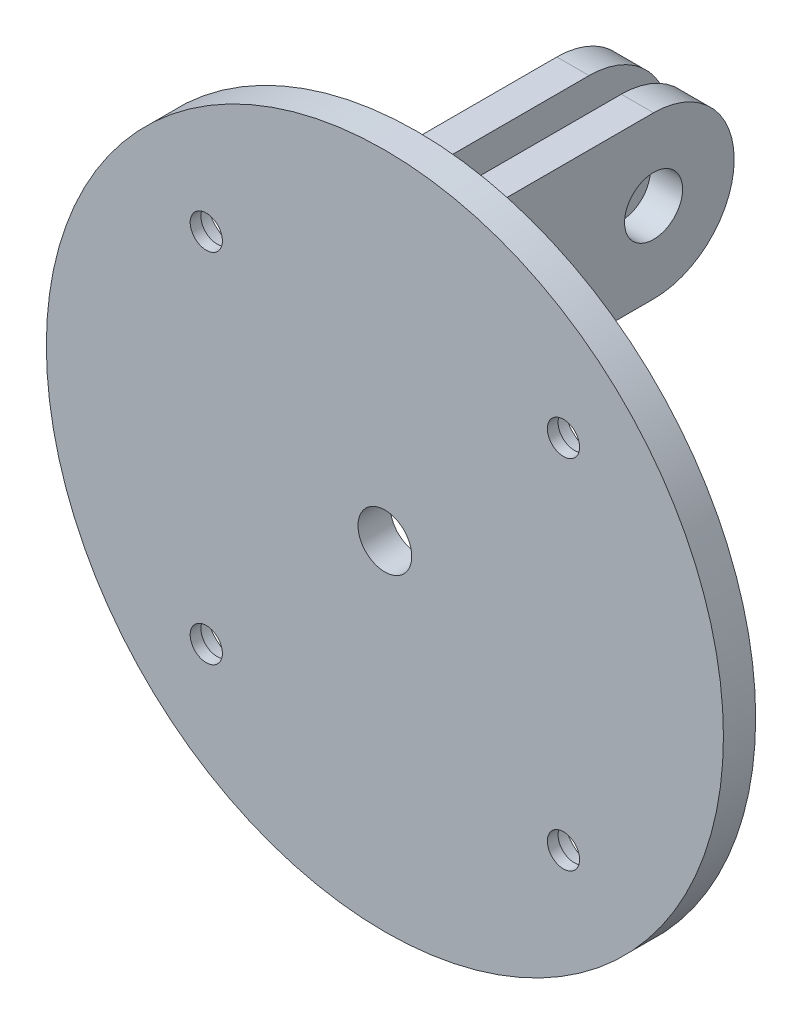
ISO-10303-21;
HEADER;
FILE_DESCRIPTION(('STEP AP214'),'2;1');
FILE_NAME('part.step','',(''),(''),'','','');
FILE_SCHEMA(('AUTOMOTIVE_DESIGN { 1 0 10303 214 1 1 1 1 }'));
ENDSEC;
DATA;
#1=APPLICATION_CONTEXT('core data for automotive mechanical design processes');
#2=APPLICATION_PROTOCOL_DEFINITION('international standard','automotive_design',2000,#1);
#3=PRODUCT_CONTEXT('',#1,'mechanical');
#4=PRODUCT('Part','Part','',(#3));
#5=PRODUCT_RELATED_PRODUCT_CATEGORY('part','',(#4));
#6=PRODUCT_DEFINITION_FORMATION('','',#4);
#7=PRODUCT_DEFINITION_CONTEXT('part definition',#1,'design');
#8=PRODUCT_DEFINITION('design','',#6,#7);
#9=PRODUCT_DEFINITION_SHAPE('','',#8);
#10=(LENGTH_UNIT() NAMED_UNIT(*) SI_UNIT(.MILLI.,.METRE.));
#11=(NAMED_UNIT(*) PLANE_ANGLE_UNIT() SI_UNIT($,.RADIAN.));
#12=(NAMED_UNIT(*) SI_UNIT($,.STERADIAN.) SOLID_ANGLE_UNIT());
#13=UNCERTAINTY_MEASURE_WITH_UNIT(LENGTH_MEASURE(1.E-05),#10,'distance_accuracy_value','');
#14=(GEOMETRIC_REPRESENTATION_CONTEXT(3) GLOBAL_UNCERTAINTY_ASSIGNED_CONTEXT((#13)) GLOBAL_UNIT_ASSIGNED_CONTEXT((#10,
#11,#12)) REPRESENTATION_CONTEXT('',''));
#15=CARTESIAN_POINT('',(0.,0.,0.));
#16=DIRECTION('',(0.,0.,1.));
#17=DIRECTION('',(1.,0.,0.));
#18=AXIS2_PLACEMENT_3D('',#15,#16,#17);
#19=CARTESIAN_POINT('',(-60.0662024055146,24.8241196667046,3.));
#20=DIRECTION('',(0.,0.,-1.));
#21=DIRECTION('',(-1.,0.,0.));
#22=AXIS2_PLACEMENT_3D('',#19,#20,#21);
#23=CYLINDRICAL_SURFACE('',#22,1.5);
#24=CARTESIAN_POINT('',(-60.0662024055146,24.8241196667046,3.));
#25=DIRECTION('',(0.,0.,1.));
#26=DIRECTION('',(1.,0.,0.));
#27=AXIS2_PLACEMENT_3D('',#24,#25,#26);
#28=CIRCLE('',#27,1.5);
#29=CARTESIAN_POINT('',(-58.5662024055146,24.8241196667046,3.));
#30=VERTEX_POINT('',#29);
#31=EDGE_CURVE('E196',#30,#30,#28,.T.);
#32=ORIENTED_EDGE('',*,*,#31,.T.);
#33=EDGE_LOOP('',(#32));
#34=FACE_BOUND('',#33,.T.);
#35=CARTESIAN_POINT('',(-60.0662024055146,24.8241196667046,2.));
#36=DIRECTION('',(0.,0.,-1.));
#37=DIRECTION('',(-1.,0.,0.));
#38=AXIS2_PLACEMENT_3D('',#35,#36,#37);
#39=CIRCLE('',#38,1.5);
#40=CARTESIAN_POINT('',(-61.5662024055146,24.8241196667046,2.));
#41=VERTEX_POINT('',#40);
#42=EDGE_CURVE('E79',#41,#41,#39,.T.);
#43=ORIENTED_EDGE('',*,*,#42,.T.);
#44=EDGE_LOOP('',(#43));
#45=FACE_BOUND('',#44,.T.);
#46=ADVANCED_FACE('F75',(#34,#45),#23,.F.);
#47=CARTESIAN_POINT('',(-26.8321836897469,24.8241196667046,3.));
#48=DIRECTION('',(0.,0.,-1.));
#49=DIRECTION('',(-1.,0.,0.));
#50=AXIS2_PLACEMENT_3D('',#47,#48,#49);
#51=CYLINDRICAL_SURFACE('',#50,1.5);
#52=CARTESIAN_POINT('',(-26.8321836897469,24.8241196667046,3.));
#53=DIRECTION('',(0.,0.,1.));
#54=DIRECTION('',(1.,0.,0.));
#55=AXIS2_PLACEMENT_3D('',#52,#53,#54);
#56=CIRCLE('',#55,1.5);
#57=CARTESIAN_POINT('',(-25.3321836897469,24.8241196667046,3.));
#58=VERTEX_POINT('',#57);
#59=EDGE_CURVE('E193',#58,#58,#56,.T.);
#60=ORIENTED_EDGE('',*,*,#59,.T.);
#61=EDGE_LOOP('',(#60));
#62=FACE_BOUND('',#61,.T.);
#63=CARTESIAN_POINT('',(-26.8321836897469,24.8241196667046,2.));
#64=DIRECTION('',(0.,0.,-1.));
#65=DIRECTION('',(-1.,0.,0.));
#66=AXIS2_PLACEMENT_3D('',#63,#64,#65);
#67=CIRCLE('',#66,1.5);
#68=CARTESIAN_POINT('',(-28.3321836897469,24.8241196667046,2.));
#69=VERTEX_POINT('',#68);
#70=EDGE_CURVE('E207',#69,#69,#67,.T.);
#71=ORIENTED_EDGE('',*,*,#70,.T.);
#72=EDGE_LOOP('',(#71));
#73=FACE_BOUND('',#72,.T.);
#74=ADVANCED_FACE('F290',(#62,#73),#51,.F.);
#75=CARTESIAN_POINT('',(-26.8321836897469,-8.40989904906317,3.));
#76=DIRECTION('',(0.,0.,-1.));
#77=DIRECTION('',(-1.,0.,0.));
#78=AXIS2_PLACEMENT_3D('',#75,#76,#77);
#79=CYLINDRICAL_SURFACE('',#78,1.5);
#80=CARTESIAN_POINT('',(-26.8321836897469,-8.40989904906317,3.));
#81=DIRECTION('',(0.,0.,1.));
#82=DIRECTION('',(1.,0.,0.));
#83=AXIS2_PLACEMENT_3D('',#80,#81,#82);
#84=CIRCLE('',#83,1.5);
#85=CARTESIAN_POINT('',(-25.3321836897469,-8.40989904906317,3.));
#86=VERTEX_POINT('',#85);
#87=EDGE_CURVE('E190',#86,#86,#84,.T.);
#88=ORIENTED_EDGE('',*,*,#87,.T.);
#89=EDGE_LOOP('',(#88));
#90=FACE_BOUND('',#89,.T.);
#91=CARTESIAN_POINT('',(-26.8321836897469,-8.40989904906317,2.));
#92=DIRECTION('',(0.,0.,-1.));
#93=DIRECTION('',(-1.,0.,0.));
#94=AXIS2_PLACEMENT_3D('',#91,#92,#93);
#95=CIRCLE('',#94,1.5);
#96=CARTESIAN_POINT('',(-28.3321836897469,-8.40989904906317,2.));
#97=VERTEX_POINT('',#96);
#98=EDGE_CURVE('E204',#97,#97,#95,.T.);
#99=ORIENTED_EDGE('',*,*,#98,.T.);
#100=EDGE_LOOP('',(#99));
#101=FACE_BOUND('',#100,.T.);
#102=ADVANCED_FACE('F296',(#90,#101),#79,.F.);
#103=CARTESIAN_POINT('',(-60.0662024055146,-8.40989904906316,3.));
#104=DIRECTION('',(0.,0.,-1.));
#105=DIRECTION('',(-1.,0.,0.));
#106=AXIS2_PLACEMENT_3D('',#103,#104,#105);
#107=CYLINDRICAL_SURFACE('',#106,1.5);
#108=CARTESIAN_POINT('',(-60.0662024055146,-8.40989904906316,3.));
#109=DIRECTION('',(0.,0.,1.));
#110=DIRECTION('',(1.,0.,0.));
#111=AXIS2_PLACEMENT_3D('',#108,#109,#110);
#112=CIRCLE('',#111,1.5);
#113=CARTESIAN_POINT('',(-58.5662024055146,-8.40989904906316,3.));
#114=VERTEX_POINT('',#113);
#115=EDGE_CURVE('E185',#114,#114,#112,.T.);
#116=ORIENTED_EDGE('',*,*,#115,.T.);
#117=EDGE_LOOP('',(#116));
#118=FACE_BOUND('',#117,.T.);
#119=CARTESIAN_POINT('',(-60.0662024055146,-8.40989904906316,2.));
#120=DIRECTION('',(0.,0.,-1.));
#121=DIRECTION('',(-1.,0.,0.));
#122=AXIS2_PLACEMENT_3D('',#119,#120,#121);
#123=CIRCLE('',#122,1.5);
#124=CARTESIAN_POINT('',(-61.5662024055146,-8.40989904906316,2.));
#125=VERTEX_POINT('',#124);
#126=EDGE_CURVE('E201',#125,#125,#123,.T.);
#127=ORIENTED_EDGE('',*,*,#126,.T.);
#128=EDGE_LOOP('',(#127));
#129=FACE_BOUND('',#128,.T.);
#130=ADVANCED_FACE('F269',(#118,#129),#107,.F.);
#131=CARTESIAN_POINT('',(-44.9491930476308,19.7071103088207,-25.));
#132=DIRECTION('',(-1.,0.,0.));
#133=DIRECTION('',(0.,0.,1.));
#134=AXIS2_PLACEMENT_3D('',#131,#132,#133);
#135=PLANE('',#134);
#136=DIRECTION('',(0.,0.,1.));
#137=VECTOR('',#136,1.);
#138=CARTESIAN_POINT('',(-44.9491930476308,19.7071103088207,-25.));
#139=LINE('',#138,#137);
#140=CARTESIAN_POINT('',(-44.9491930476308,19.7071103088207,-17.5));
#141=VERTEX_POINT('',#140);
#142=CARTESIAN_POINT('',(-44.9491930476308,19.7071103088207,0.));
#143=VERTEX_POINT('',#142);
#144=EDGE_CURVE('E172',#141,#143,#139,.T.);
#145=ORIENTED_EDGE('',*,*,#144,.F.);
#146=CARTESIAN_POINT('',(-44.9491930476308,27.2071103088207,-17.5));
#147=DIRECTION('',(-1.,0.,0.));
#148=DIRECTION('',(0.,0.,1.));
#149=AXIS2_PLACEMENT_3D('',#146,#147,#148);
#150=CIRCLE('',#149,7.50000000000001);
#151=CARTESIAN_POINT('',(-44.9491930476308,34.7071103088207,-17.5));
#152=VERTEX_POINT('',#151);
#153=EDGE_CURVE('E162',#141,#152,#150,.F.);
#154=ORIENTED_EDGE('',*,*,#153,.T.);
#155=DIRECTION('',(0.,0.,1.));
#156=VECTOR('',#155,1.);
#157=CARTESIAN_POINT('',(-44.9491930476308,34.7071103088207,-25.));
#158=LINE('',#157,#156);
#159=CARTESIAN_POINT('',(-44.9491930476308,34.7071103088207,0.));
#160=VERTEX_POINT('',#159);
#161=EDGE_CURVE('E174',#152,#160,#158,.T.);
#162=ORIENTED_EDGE('',*,*,#161,.T.);
#163=DIRECTION('',(0.,-1.,0.));
#164=VECTOR('',#163,1.);
#165=CARTESIAN_POINT('',(-44.9491930476308,19.7071103088207,0.));
#166=LINE('',#165,#164);
#167=EDGE_CURVE('E254',#160,#143,#166,.T.);
#168=ORIENTED_EDGE('',*,*,#167,.T.);
#169=EDGE_LOOP('',(#145,#154,#162,#168));
#170=FACE_BOUND('',#169,.T.);
#171=CARTESIAN_POINT('',(-44.9491930476308,27.2071103088207,-17.5));
#172=DIRECTION('',(-1.,0.,0.));
#173=DIRECTION('',(0.,0.,1.));
#174=AXIS2_PLACEMENT_3D('',#171,#172,#173);
#175=CIRCLE('',#174,2.7);
#176=CARTESIAN_POINT('',(-44.9491930476308,27.2071103088207,-14.8));
#177=VERTEX_POINT('',#176);
#178=EDGE_CURVE('E226',#177,#177,#175,.T.);
#179=ORIENTED_EDGE('',*,*,#178,.T.);
#180=EDGE_LOOP('',(#179));
#181=FACE_BOUND('',#180,.T.);
#182=ADVANCED_FACE('F266',(#170,#181),#135,.F.);
#183=CARTESIAN_POINT('',(-47.9491930476308,34.7071103088207,-25.));
#184=DIRECTION('',(1.,0.,0.));
#185=DIRECTION('',(0.,1.,0.));
#186=AXIS2_PLACEMENT_3D('',#183,#184,#185);
#187=PLANE('',#186);
#188=CARTESIAN_POINT('',(-47.9491930476308,27.2071103088207,-17.5));
#189=DIRECTION('',(1.,0.,0.));
#190=DIRECTION('',(0.,1.,0.));
#191=AXIS2_PLACEMENT_3D('',#188,#189,#190);
#192=CIRCLE('',#191,7.50000000000001);
#193=CARTESIAN_POINT('',(-47.9491930476308,34.7071103088207,-17.5));
#194=VERTEX_POINT('',#193);
#195=CARTESIAN_POINT('',(-47.9491930476308,19.7071103088207,-17.5));
#196=VERTEX_POINT('',#195);
#197=EDGE_CURVE('E144',#194,#196,#192,.F.);
#198=ORIENTED_EDGE('',*,*,#197,.T.);
#199=DIRECTION('',(0.,0.,1.));
#200=VECTOR('',#199,1.);
#201=CARTESIAN_POINT('',(-47.9491930476308,19.7071103088207,-25.));
#202=LINE('',#201,#200);
#203=CARTESIAN_POINT('',(-47.9491930476308,19.7071103088207,0.));
#204=VERTEX_POINT('',#203);
#205=EDGE_CURVE('E150',#196,#204,#202,.T.);
#206=ORIENTED_EDGE('',*,*,#205,.T.);
#207=DIRECTION('',(0.,1.,0.));
#208=VECTOR('',#207,1.);
#209=CARTESIAN_POINT('',(-47.9491930476308,34.7071103088207,0.));
#210=LINE('',#209,#208);
#211=CARTESIAN_POINT('',(-47.9491930476308,34.7071103088207,0.));
#212=VERTEX_POINT('',#211);
#213=EDGE_CURVE('E176',#204,#212,#210,.T.);
#214=ORIENTED_EDGE('',*,*,#213,.T.);
#215=DIRECTION('',(0.,0.,1.));
#216=VECTOR('',#215,1.);
#217=CARTESIAN_POINT('',(-47.9491930476308,34.7071103088207,-25.));
#218=LINE('',#217,#216);
#219=EDGE_CURVE('E152',#194,#212,#218,.T.);
#220=ORIENTED_EDGE('',*,*,#219,.F.);
#221=EDGE_LOOP('',(#198,#206,#214,#220));
#222=FACE_BOUND('',#221,.T.);
#223=CARTESIAN_POINT('',(-47.9491930476308,27.2071103088207,-17.5));
#224=DIRECTION('',(1.,0.,0.));
#225=DIRECTION('',(0.,1.,0.));
#226=AXIS2_PLACEMENT_3D('',#223,#224,#225);
#227=CIRCLE('',#226,2.7);
#228=CARTESIAN_POINT('',(-47.9491930476308,29.9071103088207,-17.5));
#229=VERTEX_POINT('',#228);
#230=EDGE_CURVE('E216',#229,#229,#227,.T.);
#231=ORIENTED_EDGE('',*,*,#230,.T.);
#232=EDGE_LOOP('',(#231));
#233=FACE_BOUND('',#232,.T.);
#234=ADVANCED_FACE('F146',(#222,#233),#187,.F.);
#235=CARTESIAN_POINT('',(-41.9491930476308,19.7071103088207,-25.));
#236=DIRECTION('',(1.,0.,0.));
#237=DIRECTION('',(0.,0.,-1.));
#238=AXIS2_PLACEMENT_3D('',#235,#236,#237);
#239=PLANE('',#238);
#240=CARTESIAN_POINT('',(-41.9491930476308,27.2071103088207,-17.5));
#241=DIRECTION('',(1.,0.,0.));
#242=DIRECTION('',(0.,0.,-1.));
#243=AXIS2_PLACEMENT_3D('',#240,#241,#242);
#244=CIRCLE('',#243,7.50000000000001);
#245=CARTESIAN_POINT('',(-41.9491930476308,34.7071103088207,-17.5));
#246=VERTEX_POINT('',#245);
#247=CARTESIAN_POINT('',(-41.9491930476308,19.7071103088207,-17.5));
#248=VERTEX_POINT('',#247);
#249=EDGE_CURVE('E232',#246,#248,#244,.F.);
#250=ORIENTED_EDGE('',*,*,#249,.T.);
#251=DIRECTION('',(0.,0.,1.));
#252=VECTOR('',#251,1.);
#253=CARTESIAN_POINT('',(-41.9491930476308,19.7071103088207,-25.));
#254=LINE('',#253,#252);
#255=CARTESIAN_POINT('',(-41.9491930476308,19.7071103088207,0.));
#256=VERTEX_POINT('',#255);
#257=EDGE_CURVE('E92',#248,#256,#254,.T.);
#258=ORIENTED_EDGE('',*,*,#257,.T.);
#259=DIRECTION('',(0.,1.,0.));
#260=VECTOR('',#259,1.);
#261=CARTESIAN_POINT('',(-41.9491930476308,19.7071103088207,0.));
#262=LINE('',#261,#260);
#263=CARTESIAN_POINT('',(-41.9491930476308,34.7071103088207,0.));
#264=VERTEX_POINT('',#263);
#265=EDGE_CURVE('E238',#256,#264,#262,.T.);
#266=ORIENTED_EDGE('',*,*,#265,.T.);
#267=DIRECTION('',(0.,0.,1.));
#268=VECTOR('',#267,1.);
#269=CARTESIAN_POINT('',(-41.9491930476308,34.7071103088207,-25.));
#270=LINE('',#269,#268);
#271=EDGE_CURVE('E100',#246,#264,#270,.T.);
#272=ORIENTED_EDGE('',*,*,#271,.F.);
#273=EDGE_LOOP('',(#250,#258,#266,#272));
#274=FACE_BOUND('',#273,.T.);
#275=CARTESIAN_POINT('',(-41.9491930476308,27.2071103088207,-17.5));
#276=DIRECTION('',(1.,0.,0.));
#277=DIRECTION('',(0.,0.,-1.));
#278=AXIS2_PLACEMENT_3D('',#275,#276,#277);
#279=CIRCLE('',#278,2.7);
#280=CARTESIAN_POINT('',(-41.9491930476308,27.2071103088207,-20.2));
#281=VERTEX_POINT('',#280);
#282=EDGE_CURVE('E165',#281,#281,#279,.T.);
#283=ORIENTED_EDGE('',*,*,#282,.T.);
#284=EDGE_LOOP('',(#283));
#285=FACE_BOUND('',#284,.T.);
#286=ADVANCED_FACE('F510',(#274,#285),#239,.F.);
#287=CARTESIAN_POINT('',(-38.9491930476308,34.7071103088207,-25.));
#288=DIRECTION('',(-1.,0.,0.));
#289=DIRECTION('',(0.,-1.,0.));
#290=AXIS2_PLACEMENT_3D('',#287,#288,#289);
#291=PLANE('',#290);
#292=DIRECTION('',(0.,0.,1.));
#293=VECTOR('',#292,1.);
#294=CARTESIAN_POINT('',(-38.9491930476308,19.7071103088207,-25.));
#295=LINE('',#294,#293);
#296=CARTESIAN_POINT('',(-38.9491930476308,19.7071103088207,-17.5));
#297=VERTEX_POINT('',#296);
#298=CARTESIAN_POINT('',(-38.9491930476308,19.7071103088207,0.));
#299=VERTEX_POINT('',#298);
#300=EDGE_CURVE('E245',#297,#299,#295,.T.);
#301=ORIENTED_EDGE('',*,*,#300,.F.);
#302=CARTESIAN_POINT('',(-38.9491930476308,27.2071103088207,-17.5));
#303=DIRECTION('',(1.,0.,0.));
#304=DIRECTION('',(0.,1.,0.));
#305=AXIS2_PLACEMENT_3D('',#302,#303,#304);
#306=CIRCLE('',#305,7.50000000000001);
#307=CARTESIAN_POINT('',(-38.9491930476307,34.7071103088207,-17.5));
#308=VERTEX_POINT('',#307);
#309=EDGE_CURVE('E156',#308,#297,#306,.F.);
#310=ORIENTED_EDGE('',*,*,#309,.F.);
#311=DIRECTION('',(0.,0.,1.));
#312=VECTOR('',#311,1.);
#313=CARTESIAN_POINT('',(-38.9491930476308,34.7071103088207,-25.));
#314=LINE('',#313,#312);
#315=CARTESIAN_POINT('',(-38.9491930476308,34.7071103088207,0.));
#316=VERTEX_POINT('',#315);
#317=EDGE_CURVE('E247',#308,#316,#314,.T.);
#318=ORIENTED_EDGE('',*,*,#317,.T.);
#319=DIRECTION('',(0.,-1.,0.));
#320=VECTOR('',#319,1.);
#321=CARTESIAN_POINT('',(-38.9491930476308,34.7071103088207,0.));
#322=LINE('',#321,#320);
#323=EDGE_CURVE('E242',#316,#299,#322,.T.);
#324=ORIENTED_EDGE('',*,*,#323,.T.);
#325=EDGE_LOOP('',(#301,#310,#318,#324));
#326=FACE_BOUND('',#325,.T.);
#327=CARTESIAN_POINT('',(-38.9491930476308,27.2071103088207,-17.5));
#328=DIRECTION('',(1.,0.,0.));
#329=DIRECTION('',(0.,1.,0.));
#330=AXIS2_PLACEMENT_3D('',#327,#328,#329);
#331=CIRCLE('',#330,2.7);
#332=CARTESIAN_POINT('',(-38.9491930476308,29.9071103088207,-17.5));
#333=VERTEX_POINT('',#332);
#334=EDGE_CURVE('E212',#333,#333,#331,.T.);
#335=ORIENTED_EDGE('',*,*,#334,.F.);
#336=EDGE_LOOP('',(#335));
#337=FACE_BOUND('',#336,.T.);
#338=ADVANCED_FACE('F501',(#326,#337),#291,.F.);
#339=CARTESIAN_POINT('',(-44.9491930476308,19.7071103088207,-25.));
#340=DIRECTION('',(0.,1.,0.));
#341=DIRECTION('',(0.,0.,1.));
#342=AXIS2_PLACEMENT_3D('',#339,#340,#341);
#343=PLANE('',#342);
#344=DIRECTION('',(1.,0.,0.));
#345=VECTOR('',#344,1.);
#346=CARTESIAN_POINT('',(-47.9491930476308,19.7071103088207,-17.5));
#347=LINE('',#346,#345);
#348=EDGE_CURVE('E159',#196,#141,#347,.T.);
#349=ORIENTED_EDGE('',*,*,#348,.T.);
#350=ORIENTED_EDGE('',*,*,#144,.T.);
#351=DIRECTION('',(-1.,0.,0.));
#352=VECTOR('',#351,1.);
#353=CARTESIAN_POINT('',(-44.9491930476308,19.7071103088207,0.));
#354=LINE('',#353,#352);
#355=EDGE_CURVE('E171',#143,#204,#354,.T.);
#356=ORIENTED_EDGE('',*,*,#355,.T.);
#357=ORIENTED_EDGE('',*,*,#205,.F.);
#358=EDGE_LOOP('',(#349,#350,#356,#357));
#359=FACE_BOUND('',#358,.T.);
#360=ADVANCED_FACE('F169',(#359),#343,.F.);
#361=CARTESIAN_POINT('',(-38.9491930476308,19.7071103088207,-25.));
#362=DIRECTION('',(0.,1.,0.));
#363=DIRECTION('',(0.,0.,1.));
#364=AXIS2_PLACEMENT_3D('',#361,#362,#363);
#365=PLANE('',#364);
#366=EDGE_CURVE('E166',#248,#297,#347,.T.);
#367=ORIENTED_EDGE('',*,*,#366,.T.);
#368=ORIENTED_EDGE('',*,*,#300,.T.);
#369=DIRECTION('',(-1.,0.,0.));
#370=VECTOR('',#369,1.);
#371=CARTESIAN_POINT('',(-38.9491930476308,19.7071103088207,0.));
#372=LINE('',#371,#370);
#373=EDGE_CURVE('E235',#299,#256,#372,.T.);
#374=ORIENTED_EDGE('',*,*,#373,.T.);
#375=ORIENTED_EDGE('',*,*,#257,.F.);
#376=EDGE_LOOP('',(#367,#368,#374,#375));
#377=FACE_BOUND('',#376,.T.);
#378=ADVANCED_FACE('F305',(#377),#365,.F.);
#379=CARTESIAN_POINT('',(-43.4491930476308,8.20711030882074,0.));
#380=DIRECTION('',(0.,0.,1.));
#381=DIRECTION('',(1.,0.,0.));
#382=AXIS2_PLACEMENT_3D('',#379,#380,#381);
#383=PLANE('',#382);
#384=CARTESIAN_POINT('',(-26.8321836897469,-8.40989904906317,0.));
#385=DIRECTION('',(0.,0.,-1.));
#386=DIRECTION('',(-1.,0.,0.));
#387=AXIS2_PLACEMENT_3D('',#384,#385,#386);
#388=CIRCLE('',#387,3.);
#389=CARTESIAN_POINT('',(-29.8321836897469,-8.40989904906317,0.));
#390=VERTEX_POINT('',#389);
#391=EDGE_CURVE('E315',#390,#390,#388,.T.);
#392=ORIENTED_EDGE('',*,*,#391,.F.);
#393=EDGE_LOOP('',(#392));
#394=FACE_BOUND('',#393,.T.);
#395=CARTESIAN_POINT('',(-60.0662024055146,-8.40989904906316,0.));
#396=DIRECTION('',(0.,0.,-1.));
#397=DIRECTION('',(-1.,0.,0.));
#398=AXIS2_PLACEMENT_3D('',#395,#396,#397);
#399=CIRCLE('',#398,3.00000000000001);
#400=CARTESIAN_POINT('',(-63.0662024055146,-8.40989904906316,0.));
#401=VERTEX_POINT('',#400);
#402=EDGE_CURVE('E319',#401,#401,#399,.T.);
#403=ORIENTED_EDGE('',*,*,#402,.F.);
#404=EDGE_LOOP('',(#403));
#405=FACE_BOUND('',#404,.T.);
#406=CARTESIAN_POINT('',(-60.0662024055146,24.8241196667046,0.));
#407=DIRECTION('',(0.,0.,-1.));
#408=DIRECTION('',(-1.,0.,0.));
#409=AXIS2_PLACEMENT_3D('',#406,#407,#408);
#410=CIRCLE('',#409,3.);
#411=CARTESIAN_POINT('',(-63.0662024055146,24.8241196667046,0.));
#412=VERTEX_POINT('',#411);
#413=EDGE_CURVE('E323',#412,#412,#410,.T.);
#414=ORIENTED_EDGE('',*,*,#413,.F.);
#415=EDGE_LOOP('',(#414));
#416=FACE_BOUND('',#415,.T.);
#417=CARTESIAN_POINT('',(-26.8321836897469,24.8241196667046,0.));
#418=DIRECTION('',(0.,0.,-1.));
#419=DIRECTION('',(-1.,0.,0.));
#420=AXIS2_PLACEMENT_3D('',#417,#418,#419);
#421=CIRCLE('',#420,3.);
#422=CARTESIAN_POINT('',(-29.8321836897469,24.8241196667046,0.));
#423=VERTEX_POINT('',#422);
#424=EDGE_CURVE('E326',#423,#423,#421,.T.);
#425=ORIENTED_EDGE('',*,*,#424,.F.);
#426=EDGE_LOOP('',(#425));
#427=FACE_BOUND('',#426,.T.);
#428=DIRECTION('',(1.,0.,0.));
#429=VECTOR('',#428,1.);
#430=CARTESIAN_POINT('',(-44.9491930476308,34.7071103088207,0.));
#431=LINE('',#430,#429);
#432=EDGE_CURVE('E251',#212,#160,#431,.T.);
#433=ORIENTED_EDGE('',*,*,#432,.F.);
#434=ORIENTED_EDGE('',*,*,#213,.F.);
#435=ORIENTED_EDGE('',*,*,#355,.F.);
#436=ORIENTED_EDGE('',*,*,#167,.F.);
#437=EDGE_LOOP('',(#433,#434,#435,#436));
#438=FACE_BOUND('',#437,.T.);
#439=CARTESIAN_POINT('',(-43.4491930476308,8.20711030882074,0.));
#440=DIRECTION('',(0.,0.,-1.));
#441=DIRECTION('',(-1.,0.,0.));
#442=AXIS2_PLACEMENT_3D('',#439,#440,#441);
#443=CIRCLE('',#442,2.5);
#444=CARTESIAN_POINT('',(-45.9491930476308,8.20711030882074,0.));
#445=VERTEX_POINT('',#444);
#446=EDGE_CURVE('E181',#445,#445,#443,.T.);
#447=ORIENTED_EDGE('',*,*,#446,.F.);
#448=EDGE_LOOP('',(#447));
#449=FACE_BOUND('',#448,.T.);
#450=CARTESIAN_POINT('',(-43.4491930476308,8.20711030882074,0.));
#451=DIRECTION('',(0.,0.,1.));
#452=DIRECTION('',(1.,0.,0.));
#453=AXIS2_PLACEMENT_3D('',#450,#451,#452);
#454=CIRCLE('',#453,31.5);
#455=CARTESIAN_POINT('',(-11.9491930476308,8.20711030882074,0.));
#456=VERTEX_POINT('',#455);
#457=EDGE_CURVE('E84',#456,#456,#454,.T.);
#458=ORIENTED_EDGE('',*,*,#457,.F.);
#459=EDGE_LOOP('',(#458));
#460=FACE_BOUND('',#459,.T.);
#461=ORIENTED_EDGE('',*,*,#373,.F.);
#462=ORIENTED_EDGE('',*,*,#323,.F.);
#463=DIRECTION('',(1.,0.,0.));
#464=VECTOR('',#463,1.);
#465=CARTESIAN_POINT('',(-38.9491930476308,34.7071103088207,0.));
#466=LINE('',#465,#464);
#467=EDGE_CURVE('E240',#264,#316,#466,.T.);
#468=ORIENTED_EDGE('',*,*,#467,.F.);
#469=ORIENTED_EDGE('',*,*,#265,.F.);
#470=EDGE_LOOP('',(#461,#462,#468,#469));
#471=FACE_BOUND('',#470,.T.);
#472=ADVANCED_FACE('F259',(#394,#405,#416,#427,#438,#449,#460,#471),#383,.F.);
#473=CARTESIAN_POINT('',(-43.4491930476308,8.20711030882074,3.));
#474=DIRECTION('',(0.,0.,1.));
#475=DIRECTION('',(1.,0.,0.));
#476=AXIS2_PLACEMENT_3D('',#473,#474,#475);
#477=PLANE('',#476);
#478=CARTESIAN_POINT('',(-43.4491930476308,8.20711030882074,3.));
#479=DIRECTION('',(0.,0.,-1.));
#480=DIRECTION('',(-1.,0.,0.));
#481=AXIS2_PLACEMENT_3D('',#478,#479,#480);
#482=CIRCLE('',#481,2.5);
#483=CARTESIAN_POINT('',(-45.9491930476308,8.20711030882074,3.));
#484=VERTEX_POINT('',#483);
#485=EDGE_CURVE('E182',#484,#484,#482,.T.);
#486=ORIENTED_EDGE('',*,*,#485,.T.);
#487=EDGE_LOOP('',(#486));
#488=FACE_BOUND('',#487,.T.);
#489=ORIENTED_EDGE('',*,*,#87,.F.);
#490=EDGE_LOOP('',(#489));
#491=FACE_BOUND('',#490,.T.);
#492=ORIENTED_EDGE('',*,*,#31,.F.);
#493=EDGE_LOOP('',(#492));
#494=FACE_BOUND('',#493,.T.);
#495=CARTESIAN_POINT('',(-43.4491930476308,8.20711030882074,3.));
#496=DIRECTION('',(0.,0.,1.));
#497=DIRECTION('',(1.,0.,0.));
#498=AXIS2_PLACEMENT_3D('',#495,#496,#497);
#499=CIRCLE('',#498,31.5);
#500=CARTESIAN_POINT('',(-11.9491930476308,8.20711030882074,3.));
#501=VERTEX_POINT('',#500);
#502=EDGE_CURVE('E12',#501,#501,#499,.T.);
#503=ORIENTED_EDGE('',*,*,#502,.T.);
#504=EDGE_LOOP('',(#503));
#505=FACE_BOUND('',#504,.T.);
#506=ORIENTED_EDGE('',*,*,#59,.F.);
#507=EDGE_LOOP('',(#506));
#508=FACE_BOUND('',#507,.T.);
#509=ORIENTED_EDGE('',*,*,#115,.F.);
#510=EDGE_LOOP('',(#509));
#511=FACE_BOUND('',#510,.T.);
#512=ADVANCED_FACE('F301',(#488,#491,#494,#505,#508,#511),#477,.T.);
#513=CARTESIAN_POINT('',(-43.4491930476308,8.20711030882074,3.));
#514=DIRECTION('',(0.,0.,-1.));
#515=DIRECTION('',(-1.,0.,0.));
#516=AXIS2_PLACEMENT_3D('',#513,#514,#515);
#517=CYLINDRICAL_SURFACE('',#516,31.5);
#518=ORIENTED_EDGE('',*,*,#502,.F.);
#519=EDGE_LOOP('',(#518));
#520=FACE_BOUND('',#519,.T.);
#521=ORIENTED_EDGE('',*,*,#457,.T.);
#522=EDGE_LOOP('',(#521));
#523=FACE_BOUND('',#522,.T.);
#524=ADVANCED_FACE('F77',(#520,#523),#517,.T.);
#525=CARTESIAN_POINT('',(-43.4491930476308,8.20711030882074,3.));
#526=DIRECTION('',(0.,0.,-1.));
#527=DIRECTION('',(-1.,0.,0.));
#528=AXIS2_PLACEMENT_3D('',#525,#526,#527);
#529=CYLINDRICAL_SURFACE('',#528,2.5);
#530=ORIENTED_EDGE('',*,*,#485,.F.);
#531=EDGE_LOOP('',(#530));
#532=FACE_BOUND('',#531,.T.);
#533=ORIENTED_EDGE('',*,*,#446,.T.);
#534=EDGE_LOOP('',(#533));
#535=FACE_BOUND('',#534,.T.);
#536=ADVANCED_FACE('F485',(#532,#535),#529,.F.);
#537=CARTESIAN_POINT('',(-44.9491930476308,34.7071103088207,-25.));
#538=DIRECTION('',(0.,-1.,0.));
#539=DIRECTION('',(0.,0.,-1.));
#540=AXIS2_PLACEMENT_3D('',#537,#538,#539);
#541=PLANE('',#540);
#542=ORIENTED_EDGE('',*,*,#161,.F.);
#543=DIRECTION('',(1.,0.,0.));
#544=VECTOR('',#543,1.);
#545=CARTESIAN_POINT('',(-47.9491930476308,34.7071103088207,-17.5));
#546=LINE('',#545,#544);
#547=EDGE_CURVE('E230',#194,#152,#546,.T.);
#548=ORIENTED_EDGE('',*,*,#547,.F.);
#549=ORIENTED_EDGE('',*,*,#219,.T.);
#550=ORIENTED_EDGE('',*,*,#432,.T.);
#551=EDGE_LOOP('',(#542,#548,#549,#550));
#552=FACE_BOUND('',#551,.T.);
#553=ADVANCED_FACE('F264',(#552),#541,.F.);
#554=CARTESIAN_POINT('',(-38.9491930476308,34.7071103088207,-25.));
#555=DIRECTION('',(0.,-1.,0.));
#556=DIRECTION('',(0.,0.,-1.));
#557=AXIS2_PLACEMENT_3D('',#554,#555,#556);
#558=PLANE('',#557);
#559=ORIENTED_EDGE('',*,*,#317,.F.);
#560=EDGE_CURVE('E155',#246,#308,#546,.T.);
#561=ORIENTED_EDGE('',*,*,#560,.F.);
#562=ORIENTED_EDGE('',*,*,#271,.T.);
#563=ORIENTED_EDGE('',*,*,#467,.T.);
#564=EDGE_LOOP('',(#559,#561,#562,#563));
#565=FACE_BOUND('',#564,.T.);
#566=ADVANCED_FACE('F466',(#565),#558,.F.);
#567=CARTESIAN_POINT('',(-47.9491930476308,27.2071103088207,-17.5));
#568=DIRECTION('',(1.,0.,0.));
#569=DIRECTION('',(0.,1.,0.));
#570=AXIS2_PLACEMENT_3D('',#567,#568,#569);
#571=CYLINDRICAL_SURFACE('',#570,7.50000000000001);
#572=ORIENTED_EDGE('',*,*,#560,.T.);
#573=ORIENTED_EDGE('',*,*,#309,.T.);
#574=ORIENTED_EDGE('',*,*,#366,.F.);
#575=ORIENTED_EDGE('',*,*,#249,.F.);
#576=EDGE_LOOP('',(#572,#573,#574,#575));
#577=FACE_BOUND('',#576,.T.);
#578=ADVANCED_FACE('F456',(#577),#571,.T.);
#579=ORIENTED_EDGE('',*,*,#153,.F.);
#580=ORIENTED_EDGE('',*,*,#348,.F.);
#581=ORIENTED_EDGE('',*,*,#197,.F.);
#582=ORIENTED_EDGE('',*,*,#547,.T.);
#583=EDGE_LOOP('',(#579,#580,#581,#582));
#584=FACE_BOUND('',#583,.T.);
#585=ADVANCED_FACE('F160',(#584),#571,.T.);
#586=CARTESIAN_POINT('',(-47.9491930476308,27.2071103088207,-17.5));
#587=DIRECTION('',(1.,0.,0.));
#588=DIRECTION('',(0.,1.,0.));
#589=AXIS2_PLACEMENT_3D('',#586,#587,#588);
#590=CYLINDRICAL_SURFACE('',#589,2.7);
#591=ORIENTED_EDGE('',*,*,#334,.T.);
#592=EDGE_LOOP('',(#591));
#593=FACE_BOUND('',#592,.T.);
#594=ORIENTED_EDGE('',*,*,#282,.F.);
#595=EDGE_LOOP('',(#594));
#596=FACE_BOUND('',#595,.T.);
#597=ADVANCED_FACE('F276',(#593,#596),#590,.F.);
#598=ORIENTED_EDGE('',*,*,#230,.F.);
#599=EDGE_LOOP('',(#598));
#600=FACE_BOUND('',#599,.T.);
#601=ORIENTED_EDGE('',*,*,#178,.F.);
#602=EDGE_LOOP('',(#601));
#603=FACE_BOUND('',#602,.T.);
#604=ADVANCED_FACE('F273',(#600,#603),#590,.F.);
#605=CARTESIAN_POINT('',(-60.0662024055146,-8.40989904906316,2.));
#606=DIRECTION('',(0.,0.,-1.));
#607=DIRECTION('',(-1.,0.,0.));
#608=AXIS2_PLACEMENT_3D('',#605,#606,#607);
#609=CYLINDRICAL_SURFACE('',#608,3.00000000000001);
#610=CARTESIAN_POINT('',(-60.0662024055146,-8.40989904906316,2.));
#611=DIRECTION('',(0.,0.,-1.));
#612=DIRECTION('',(-1.,0.,0.));
#613=AXIS2_PLACEMENT_3D('',#610,#611,#612);
#614=CIRCLE('',#613,3.00000000000001);
#615=CARTESIAN_POINT('',(-63.0662024055146,-8.40989904906316,2.));
#616=VERTEX_POINT('',#615);
#617=EDGE_CURVE('E339',#616,#616,#614,.T.);
#618=ORIENTED_EDGE('',*,*,#617,.F.);
#619=EDGE_LOOP('',(#618));
#620=FACE_BOUND('',#619,.T.);
#621=ORIENTED_EDGE('',*,*,#402,.T.);
#622=EDGE_LOOP('',(#621));
#623=FACE_BOUND('',#622,.T.);
#624=ADVANCED_FACE('F275',(#620,#623),#609,.F.);
#625=CARTESIAN_POINT('',(-60.0662024055146,-8.40989904906316,2.));
#626=DIRECTION('',(0.,0.,-1.));
#627=DIRECTION('',(-1.,0.,0.));
#628=AXIS2_PLACEMENT_3D('',#625,#626,#627);
#629=PLANE('',#628);
#630=ORIENTED_EDGE('',*,*,#126,.F.);
#631=EDGE_LOOP('',(#630));
#632=FACE_BOUND('',#631,.T.);
#633=ORIENTED_EDGE('',*,*,#617,.T.);
#634=EDGE_LOOP('',(#633));
#635=FACE_BOUND('',#634,.T.);
#636=ADVANCED_FACE('F283',(#632,#635),#629,.T.);
#637=CARTESIAN_POINT('',(-26.8321836897469,-8.40989904906317,2.));
#638=DIRECTION('',(0.,0.,-1.));
#639=DIRECTION('',(-1.,0.,0.));
#640=AXIS2_PLACEMENT_3D('',#637,#638,#639);
#641=CYLINDRICAL_SURFACE('',#640,3.);
#642=CARTESIAN_POINT('',(-26.8321836897469,-8.40989904906317,2.));
#643=DIRECTION('',(0.,0.,-1.));
#644=DIRECTION('',(-1.,0.,0.));
#645=AXIS2_PLACEMENT_3D('',#642,#643,#644);
#646=CIRCLE('',#645,3.);
#647=CARTESIAN_POINT('',(-29.8321836897469,-8.40989904906317,2.));
#648=VERTEX_POINT('',#647);
#649=EDGE_CURVE('E335',#648,#648,#646,.T.);
#650=ORIENTED_EDGE('',*,*,#649,.F.);
#651=EDGE_LOOP('',(#650));
#652=FACE_BOUND('',#651,.T.);
#653=ORIENTED_EDGE('',*,*,#391,.T.);
#654=EDGE_LOOP('',(#653));
#655=FACE_BOUND('',#654,.T.);
#656=ADVANCED_FACE('F361',(#652,#655),#641,.F.);
#657=CARTESIAN_POINT('',(-26.8321836897469,-8.40989904906317,2.));
#658=DIRECTION('',(0.,0.,-1.));
#659=DIRECTION('',(-1.,0.,0.));
#660=AXIS2_PLACEMENT_3D('',#657,#658,#659);
#661=PLANE('',#660);
#662=ORIENTED_EDGE('',*,*,#98,.F.);
#663=EDGE_LOOP('',(#662));
#664=FACE_BOUND('',#663,.T.);
#665=ORIENTED_EDGE('',*,*,#649,.T.);
#666=EDGE_LOOP('',(#665));
#667=FACE_BOUND('',#666,.T.);
#668=ADVANCED_FACE('F364',(#664,#667),#661,.T.);
#669=CARTESIAN_POINT('',(-26.8321836897469,24.8241196667046,2.));
#670=DIRECTION('',(0.,0.,-1.));
#671=DIRECTION('',(-1.,0.,0.));
#672=AXIS2_PLACEMENT_3D('',#669,#670,#671);
#673=CYLINDRICAL_SURFACE('',#672,3.);
#674=CARTESIAN_POINT('',(-26.8321836897469,24.8241196667046,2.));
#675=DIRECTION('',(0.,0.,-1.));
#676=DIRECTION('',(-1.,0.,0.));
#677=AXIS2_PLACEMENT_3D('',#674,#675,#676);
#678=CIRCLE('',#677,3.);
#679=CARTESIAN_POINT('',(-29.8321836897469,24.8241196667046,2.));
#680=VERTEX_POINT('',#679);
#681=EDGE_CURVE('E205',#680,#680,#678,.T.);
#682=ORIENTED_EDGE('',*,*,#681,.F.);
#683=EDGE_LOOP('',(#682));
#684=FACE_BOUND('',#683,.T.);
#685=ORIENTED_EDGE('',*,*,#424,.T.);
#686=EDGE_LOOP('',(#685));
#687=FACE_BOUND('',#686,.T.);
#688=ADVANCED_FACE('F355',(#684,#687),#673,.F.);
#689=CARTESIAN_POINT('',(-26.8321836897469,24.8241196667046,2.));
#690=DIRECTION('',(0.,0.,-1.));
#691=DIRECTION('',(-1.,0.,0.));
#692=AXIS2_PLACEMENT_3D('',#689,#690,#691);
#693=PLANE('',#692);
#694=ORIENTED_EDGE('',*,*,#70,.F.);
#695=EDGE_LOOP('',(#694));
#696=FACE_BOUND('',#695,.T.);
#697=ORIENTED_EDGE('',*,*,#681,.T.);
#698=EDGE_LOOP('',(#697));
#699=FACE_BOUND('',#698,.T.);
#700=ADVANCED_FACE('F346',(#696,#699),#693,.T.);
#701=CARTESIAN_POINT('',(-60.0662024055146,24.8241196667046,2.));
#702=DIRECTION('',(0.,0.,-1.));
#703=DIRECTION('',(-1.,0.,0.));
#704=AXIS2_PLACEMENT_3D('',#701,#702,#703);
#705=CYLINDRICAL_SURFACE('',#704,3.);
#706=CARTESIAN_POINT('',(-60.0662024055146,24.8241196667046,2.));
#707=DIRECTION('',(0.,0.,-1.));
#708=DIRECTION('',(-1.,0.,0.));
#709=AXIS2_PLACEMENT_3D('',#706,#707,#708);
#710=CIRCLE('',#709,3.);
#711=CARTESIAN_POINT('',(-63.0662024055146,24.8241196667046,2.));
#712=VERTEX_POINT('',#711);
#713=EDGE_CURVE('E328',#712,#712,#710,.T.);
#714=ORIENTED_EDGE('',*,*,#713,.F.);
#715=EDGE_LOOP('',(#714));
#716=FACE_BOUND('',#715,.T.);
#717=ORIENTED_EDGE('',*,*,#413,.T.);
#718=EDGE_LOOP('',(#717));
#719=FACE_BOUND('',#718,.T.);
#720=ADVANCED_FACE('F343',(#716,#719),#705,.F.);
#721=CARTESIAN_POINT('',(-60.0662024055146,24.8241196667046,2.));
#722=DIRECTION('',(0.,0.,-1.));
#723=DIRECTION('',(-1.,0.,0.));
#724=AXIS2_PLACEMENT_3D('',#721,#722,#723);
#725=PLANE('',#724);
#726=ORIENTED_EDGE('',*,*,#42,.F.);
#727=EDGE_LOOP('',(#726));
#728=FACE_BOUND('',#727,.T.);
#729=ORIENTED_EDGE('',*,*,#713,.T.);
#730=EDGE_LOOP('',(#729));
#731=FACE_BOUND('',#730,.T.);
#732=ADVANCED_FACE('F345',(#728,#731),#725,.T.);
#733=CLOSED_SHELL('',(#46,#74,#102,#130,#182,#234,#286,#338,#360,#378,#472,#512,#524,#536,#553,
#566,#578,#585,#597,#604,#624,#636,#656,#668,#688,#700,#720,#732));
#734=MANIFOLD_SOLID_BREP('B2',#733);
#735=ADVANCED_BREP_SHAPE_REPRESENTATION('',(#18,#734),#14);
#736=SHAPE_DEFINITION_REPRESENTATION(#9,#735);
ENDSEC;
END-ISO-10303-21;
